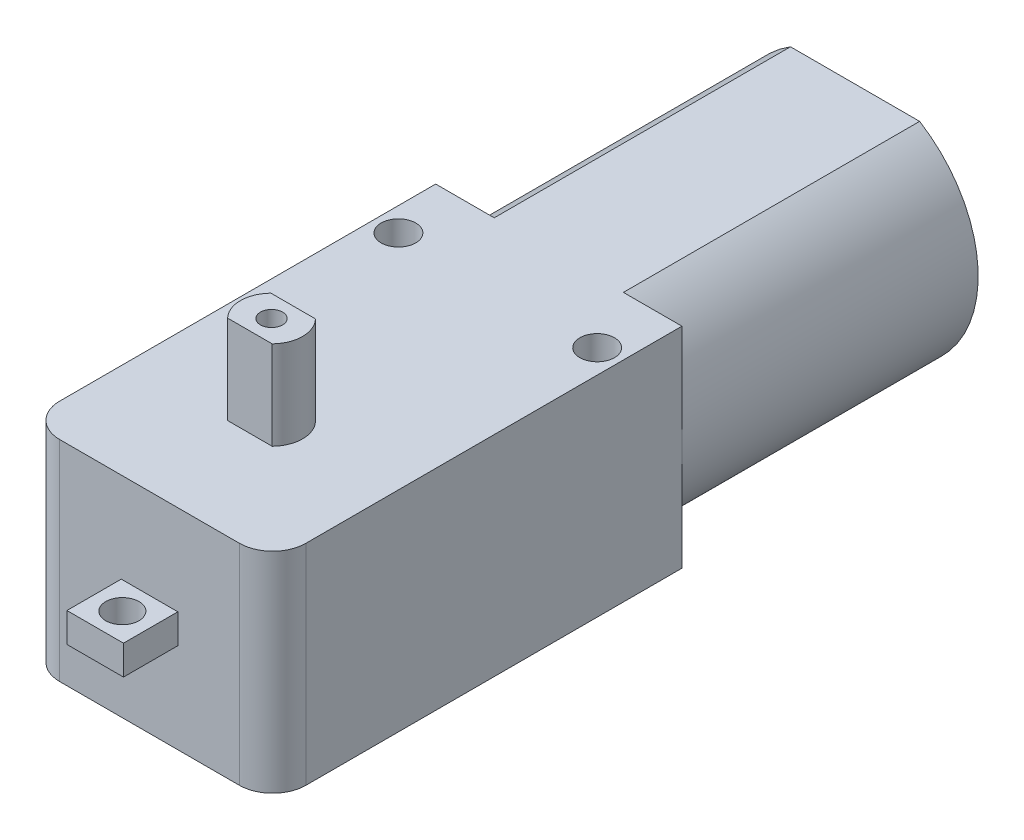
ISO-10303-21;
HEADER;
FILE_DESCRIPTION(('STEP AP214'),'2;1');
FILE_NAME('part.step','',(''),(''),'','','');
FILE_SCHEMA(('AUTOMOTIVE_DESIGN { 1 0 10303 214 1 1 1 1 }'));
ENDSEC;
DATA;
#1=APPLICATION_CONTEXT('core data for automotive mechanical design processes');
#2=APPLICATION_PROTOCOL_DEFINITION('international standard','automotive_design',2000,#1);
#3=PRODUCT_CONTEXT('',#1,'mechanical');
#4=PRODUCT('Part','Part','',(#3));
#5=PRODUCT_RELATED_PRODUCT_CATEGORY('part','',(#4));
#6=PRODUCT_DEFINITION_FORMATION('','',#4);
#7=PRODUCT_DEFINITION_CONTEXT('part definition',#1,'design');
#8=PRODUCT_DEFINITION('design','',#6,#7);
#9=PRODUCT_DEFINITION_SHAPE('','',#8);
#10=(LENGTH_UNIT() NAMED_UNIT(*) SI_UNIT(.MILLI.,.METRE.));
#11=(NAMED_UNIT(*) PLANE_ANGLE_UNIT() SI_UNIT($,.RADIAN.));
#12=(NAMED_UNIT(*) SI_UNIT($,.STERADIAN.) SOLID_ANGLE_UNIT());
#13=UNCERTAINTY_MEASURE_WITH_UNIT(LENGTH_MEASURE(1.E-05),#10,'distance_accuracy_value','');
#14=(GEOMETRIC_REPRESENTATION_CONTEXT(3) GLOBAL_UNCERTAINTY_ASSIGNED_CONTEXT((#13)) GLOBAL_UNIT_ASSIGNED_CONTEXT((#10,
#11,#12)) REPRESENTATION_CONTEXT('',''));
#15=CARTESIAN_POINT('',(0.,0.,0.));
#16=DIRECTION('',(0.,0.,1.));
#17=DIRECTION('',(1.,0.,0.));
#18=AXIS2_PLACEMENT_3D('',#15,#16,#17);
#19=CARTESIAN_POINT('',(0.,0.,-36.9));
#20=DIRECTION('',(0.,-1.,0.));
#21=DIRECTION('',(0.,0.,-1.));
#22=AXIS2_PLACEMENT_3D('',#19,#20,#21);
#23=PLANE('',#22);
#24=CARTESIAN_POINT('',(2.14,0.,-31.4));
#25=DIRECTION('',(0.,-1.,0.));
#26=DIRECTION('',(0.,0.,-1.));
#27=AXIS2_PLACEMENT_3D('',#24,#25,#26);
#28=CIRCLE('',#27,1.56);
#29=CARTESIAN_POINT('',(2.14,0.,-29.84));
#30=VERTEX_POINT('',#29);
#31=EDGE_CURVE('E771',#30,#30,#28,.T.);
#32=ORIENTED_EDGE('',*,*,#31,.F.);
#33=EDGE_LOOP('',(#32));
#34=FACE_BOUND('',#33,.T.);
#35=CARTESIAN_POINT('',(20.06,0.,-31.4));
#36=DIRECTION('',(0.,-1.,0.));
#37=DIRECTION('',(0.,0.,-1.));
#38=AXIS2_PLACEMENT_3D('',#35,#36,#37);
#39=CIRCLE('',#38,1.56);
#40=CARTESIAN_POINT('',(20.06,0.,-29.84));
#41=VERTEX_POINT('',#40);
#42=EDGE_CURVE('E774',#41,#41,#39,.T.);
#43=ORIENTED_EDGE('',*,*,#42,.F.);
#44=EDGE_LOOP('',(#43));
#45=FACE_BOUND('',#44,.T.);
#46=DIRECTION('',(1.,0.,0.));
#47=VECTOR('',#46,1.);
#48=CARTESIAN_POINT('',(0.,0.,0.));
#49=LINE('',#48,#47);
#50=CARTESIAN_POINT('',(3.,0.,0.));
#51=VERTEX_POINT('',#50);
#52=CARTESIAN_POINT('',(19.2,0.,0.));
#53=VERTEX_POINT('',#52);
#54=EDGE_CURVE('E320',#51,#53,#49,.T.);
#55=ORIENTED_EDGE('',*,*,#54,.F.);
#56=CARTESIAN_POINT('',(3.,0.,-3.));
#57=DIRECTION('',(0.,-1.,0.));
#58=DIRECTION('',(0.,0.,-1.));
#59=AXIS2_PLACEMENT_3D('',#56,#57,#58);
#60=CIRCLE('',#59,3.);
#61=CARTESIAN_POINT('',(0.,0.,-3.));
#62=VERTEX_POINT('',#61);
#63=EDGE_CURVE('E363',#51,#62,#60,.T.);
#64=ORIENTED_EDGE('',*,*,#63,.T.);
#65=DIRECTION('',(0.,0.,1.));
#66=VECTOR('',#65,1.);
#67=CARTESIAN_POINT('',(0.,0.,-36.9));
#68=LINE('',#67,#66);
#69=CARTESIAN_POINT('',(0.,0.,-36.9));
#70=VERTEX_POINT('',#69);
#71=EDGE_CURVE('E337',#70,#62,#68,.T.);
#72=ORIENTED_EDGE('',*,*,#71,.F.);
#73=DIRECTION('',(1.,0.,0.));
#74=VECTOR('',#73,1.);
#75=CARTESIAN_POINT('',(0.,0.,-36.9));
#76=LINE('',#75,#74);
#77=CARTESIAN_POINT('',(5.2769853168655,0.,-36.9));
#78=VERTEX_POINT('',#77);
#79=EDGE_CURVE('E326',#70,#78,#76,.T.);
#80=ORIENTED_EDGE('',*,*,#79,.T.);
#81=DIRECTION('',(0.,0.,1.));
#82=VECTOR('',#81,1.);
#83=CARTESIAN_POINT('',(5.2769853168655,0.,-63.61));
#84=LINE('',#83,#82);
#85=CARTESIAN_POINT('',(5.2769853168655,0.,-63.61));
#86=VERTEX_POINT('',#85);
#87=EDGE_CURVE('E281',#86,#78,#84,.T.);
#88=ORIENTED_EDGE('',*,*,#87,.F.);
#89=DIRECTION('',(-1.,0.,0.));
#90=VECTOR('',#89,1.);
#91=CARTESIAN_POINT('',(16.9230146831345,0.,-63.61));
#92=LINE('',#91,#90);
#93=CARTESIAN_POINT('',(16.9230146831345,0.,-63.61));
#94=VERTEX_POINT('',#93);
#95=EDGE_CURVE('E262',#94,#86,#92,.T.);
#96=ORIENTED_EDGE('',*,*,#95,.F.);
#97=DIRECTION('',(0.,0.,1.));
#98=VECTOR('',#97,1.);
#99=CARTESIAN_POINT('',(16.9230146831345,0.,-63.61));
#100=LINE('',#99,#98);
#101=CARTESIAN_POINT('',(16.9230146831345,0.,-36.9));
#102=VERTEX_POINT('',#101);
#103=EDGE_CURVE('E284',#94,#102,#100,.T.);
#104=ORIENTED_EDGE('',*,*,#103,.T.);
#105=CARTESIAN_POINT('',(22.2,0.,-36.9));
#106=VERTEX_POINT('',#105);
#107=EDGE_CURVE('E324',#102,#106,#76,.T.);
#108=ORIENTED_EDGE('',*,*,#107,.T.);
#109=DIRECTION('',(0.,0.,1.));
#110=VECTOR('',#109,1.);
#111=CARTESIAN_POINT('',(22.2,0.,-36.9));
#112=LINE('',#111,#110);
#113=CARTESIAN_POINT('',(22.2,0.,-3.));
#114=VERTEX_POINT('',#113);
#115=EDGE_CURVE('E347',#106,#114,#112,.T.);
#116=ORIENTED_EDGE('',*,*,#115,.T.);
#117=CARTESIAN_POINT('',(19.2,0.,-3.));
#118=DIRECTION('',(0.,-1.,0.));
#119=DIRECTION('',(0.,0.,-1.));
#120=AXIS2_PLACEMENT_3D('',#117,#118,#119);
#121=CIRCLE('',#120,3.);
#122=EDGE_CURVE('E361',#114,#53,#121,.T.);
#123=ORIENTED_EDGE('',*,*,#122,.T.);
#124=EDGE_LOOP('',(#55,#64,#72,#80,#88,#96,#104,#108,#116,#123));
#125=FACE_BOUND('',#124,.T.);
#126=DIRECTION('',(1.,0.,0.));
#127=VECTOR('',#126,1.);
#128=CARTESIAN_POINT('',(9.09064687025899,0.,-12.95));
#129=LINE('',#128,#127);
#130=CARTESIAN_POINT('',(9.09064687025899,0.,-12.95));
#131=VERTEX_POINT('',#130);
#132=CARTESIAN_POINT('',(13.109353129741,0.,-12.95));
#133=VERTEX_POINT('',#132);
#134=EDGE_CURVE('E761',#131,#133,#129,.T.);
#135=ORIENTED_EDGE('',*,*,#134,.F.);
#136=CARTESIAN_POINT('',(11.1,0.,-11.));
#137=DIRECTION('',(0.,-1.,0.));
#138=DIRECTION('',(0.,0.,-1.));
#139=AXIS2_PLACEMENT_3D('',#136,#137,#138);
#140=CIRCLE('',#139,2.8);
#141=CARTESIAN_POINT('',(9.09064687025899,0.,-9.05));
#142=VERTEX_POINT('',#141);
#143=EDGE_CURVE('E217',#142,#131,#140,.T.);
#144=ORIENTED_EDGE('',*,*,#143,.F.);
#145=DIRECTION('',(1.,0.,0.));
#146=VECTOR('',#145,1.);
#147=CARTESIAN_POINT('',(9.09064687025899,0.,-9.05));
#148=LINE('',#147,#146);
#149=CARTESIAN_POINT('',(13.109353129741,0.,-9.05));
#150=VERTEX_POINT('',#149);
#151=EDGE_CURVE('E214',#142,#150,#148,.T.);
#152=ORIENTED_EDGE('',*,*,#151,.T.);
#153=CARTESIAN_POINT('',(11.1,0.,-11.));
#154=DIRECTION('',(0.,-1.,0.));
#155=DIRECTION('',(0.,0.,-1.));
#156=AXIS2_PLACEMENT_3D('',#153,#154,#155);
#157=CIRCLE('',#156,2.8);
#158=EDGE_CURVE('E763',#133,#150,#157,.T.);
#159=ORIENTED_EDGE('',*,*,#158,.F.);
#160=EDGE_LOOP('',(#135,#144,#152,#159));
#161=FACE_BOUND('',#160,.T.);
#162=ADVANCED_FACE('F36',(#34,#45,#125,#161),#23,.T.);
#163=CARTESIAN_POINT('',(0.,18.9,-36.9));
#164=DIRECTION('',(0.,1.,0.));
#165=DIRECTION('',(0.,0.,1.));
#166=AXIS2_PLACEMENT_3D('',#163,#164,#165);
#167=PLANE('',#166);
#168=CARTESIAN_POINT('',(2.14,18.9,-31.4));
#169=DIRECTION('',(0.,1.,0.));
#170=DIRECTION('',(0.,0.,1.));
#171=AXIS2_PLACEMENT_3D('',#168,#169,#170);
#172=CIRCLE('',#171,1.56);
#173=CARTESIAN_POINT('',(2.14,18.9,-29.84));
#174=VERTEX_POINT('',#173);
#175=EDGE_CURVE('E777',#174,#174,#172,.T.);
#176=ORIENTED_EDGE('',*,*,#175,.F.);
#177=EDGE_LOOP('',(#176));
#178=FACE_BOUND('',#177,.T.);
#179=CARTESIAN_POINT('',(20.06,18.9,-31.4));
#180=DIRECTION('',(0.,1.,0.));
#181=DIRECTION('',(0.,0.,1.));
#182=AXIS2_PLACEMENT_3D('',#179,#180,#181);
#183=CIRCLE('',#182,1.56);
#184=CARTESIAN_POINT('',(20.06,18.9,-29.84));
#185=VERTEX_POINT('',#184);
#186=EDGE_CURVE('E778',#185,#185,#183,.T.);
#187=ORIENTED_EDGE('',*,*,#186,.F.);
#188=EDGE_LOOP('',(#187));
#189=FACE_BOUND('',#188,.T.);
#190=DIRECTION('',(0.,0.,1.));
#191=VECTOR('',#190,1.);
#192=CARTESIAN_POINT('',(0.,18.9,-36.9));
#193=LINE('',#192,#191);
#194=CARTESIAN_POINT('',(0.,18.9,-36.9));
#195=VERTEX_POINT('',#194);
#196=CARTESIAN_POINT('',(0.,18.9,-3.));
#197=VERTEX_POINT('',#196);
#198=EDGE_CURVE('E343',#195,#197,#193,.T.);
#199=ORIENTED_EDGE('',*,*,#198,.T.);
#200=CARTESIAN_POINT('',(3.,18.9,-3.));
#201=DIRECTION('',(0.,1.,0.));
#202=DIRECTION('',(0.,0.,1.));
#203=AXIS2_PLACEMENT_3D('',#200,#201,#202);
#204=CIRCLE('',#203,3.);
#205=CARTESIAN_POINT('',(3.,18.9,0.));
#206=VERTEX_POINT('',#205);
#207=EDGE_CURVE('E44',#197,#206,#204,.T.);
#208=ORIENTED_EDGE('',*,*,#207,.T.);
#209=DIRECTION('',(-1.,0.,0.));
#210=VECTOR('',#209,1.);
#211=CARTESIAN_POINT('',(0.,18.9,0.));
#212=LINE('',#211,#210);
#213=CARTESIAN_POINT('',(19.2,18.9,0.));
#214=VERTEX_POINT('',#213);
#215=EDGE_CURVE('E340',#214,#206,#212,.T.);
#216=ORIENTED_EDGE('',*,*,#215,.F.);
#217=CARTESIAN_POINT('',(19.2,18.9,-3.));
#218=DIRECTION('',(0.,1.,0.));
#219=DIRECTION('',(0.,0.,1.));
#220=AXIS2_PLACEMENT_3D('',#217,#218,#219);
#221=CIRCLE('',#220,3.);
#222=CARTESIAN_POINT('',(22.2,18.9,-3.));
#223=VERTEX_POINT('',#222);
#224=EDGE_CURVE('E51',#214,#223,#221,.T.);
#225=ORIENTED_EDGE('',*,*,#224,.T.);
#226=DIRECTION('',(0.,0.,1.));
#227=VECTOR('',#226,1.);
#228=CARTESIAN_POINT('',(22.2,18.9,-36.9));
#229=LINE('',#228,#227);
#230=CARTESIAN_POINT('',(22.2,18.9,-36.9));
#231=VERTEX_POINT('',#230);
#232=EDGE_CURVE('E345',#231,#223,#229,.T.);
#233=ORIENTED_EDGE('',*,*,#232,.F.);
#234=DIRECTION('',(-1.,0.,0.));
#235=VECTOR('',#234,1.);
#236=CARTESIAN_POINT('',(0.,18.9,-36.9));
#237=LINE('',#236,#235);
#238=CARTESIAN_POINT('',(16.9230146831345,18.9,-36.9));
#239=VERTEX_POINT('',#238);
#240=EDGE_CURVE('E334',#231,#239,#237,.T.);
#241=ORIENTED_EDGE('',*,*,#240,.T.);
#242=DIRECTION('',(0.,0.,1.));
#243=VECTOR('',#242,1.);
#244=CARTESIAN_POINT('',(16.9230146831345,18.9,-63.61));
#245=LINE('',#244,#243);
#246=CARTESIAN_POINT('',(16.9230146831345,18.9,-63.61));
#247=VERTEX_POINT('',#246);
#248=EDGE_CURVE('E269',#247,#239,#245,.T.);
#249=ORIENTED_EDGE('',*,*,#248,.F.);
#250=DIRECTION('',(1.,0.,0.));
#251=VECTOR('',#250,1.);
#252=CARTESIAN_POINT('',(16.9230146831345,18.9,-63.61));
#253=LINE('',#252,#251);
#254=CARTESIAN_POINT('',(5.2769853168655,18.9,-63.61));
#255=VERTEX_POINT('',#254);
#256=EDGE_CURVE('E267',#255,#247,#253,.T.);
#257=ORIENTED_EDGE('',*,*,#256,.F.);
#258=DIRECTION('',(0.,0.,1.));
#259=VECTOR('',#258,1.);
#260=CARTESIAN_POINT('',(5.2769853168655,18.9,-63.61));
#261=LINE('',#260,#259);
#262=CARTESIAN_POINT('',(5.2769853168655,18.9,-36.9));
#263=VERTEX_POINT('',#262);
#264=EDGE_CURVE('E278',#255,#263,#261,.T.);
#265=ORIENTED_EDGE('',*,*,#264,.T.);
#266=EDGE_CURVE('E333',#263,#195,#237,.T.);
#267=ORIENTED_EDGE('',*,*,#266,.T.);
#268=EDGE_LOOP('',(#199,#208,#216,#225,#233,#241,#249,#257,#265,#267));
#269=FACE_BOUND('',#268,.T.);
#270=DIRECTION('',(1.,0.,0.));
#271=VECTOR('',#270,1.);
#272=CARTESIAN_POINT('',(9.09064687025899,18.9,-9.05));
#273=LINE('',#272,#271);
#274=CARTESIAN_POINT('',(9.09064687025899,18.9,-9.05));
#275=VERTEX_POINT('',#274);
#276=CARTESIAN_POINT('',(13.109353129741,18.9,-9.05));
#277=VERTEX_POINT('',#276);
#278=EDGE_CURVE('E221',#275,#277,#273,.T.);
#279=ORIENTED_EDGE('',*,*,#278,.F.);
#280=CARTESIAN_POINT('',(11.1,18.9,-11.));
#281=DIRECTION('',(0.,1.,0.));
#282=DIRECTION('',(0.,0.,1.));
#283=AXIS2_PLACEMENT_3D('',#280,#281,#282);
#284=CIRCLE('',#283,2.8);
#285=CARTESIAN_POINT('',(9.09064687025899,18.9,-12.95));
#286=VERTEX_POINT('',#285);
#287=EDGE_CURVE('E218',#286,#275,#284,.T.);
#288=ORIENTED_EDGE('',*,*,#287,.F.);
#289=DIRECTION('',(-1.,0.,0.));
#290=VECTOR('',#289,1.);
#291=CARTESIAN_POINT('',(9.09064687025899,18.9,-12.95));
#292=LINE('',#291,#290);
#293=CARTESIAN_POINT('',(13.109353129741,18.9,-12.95));
#294=VERTEX_POINT('',#293);
#295=EDGE_CURVE('E231',#294,#286,#292,.T.);
#296=ORIENTED_EDGE('',*,*,#295,.F.);
#297=CARTESIAN_POINT('',(11.1,18.9,-11.));
#298=DIRECTION('',(0.,1.,0.));
#299=DIRECTION('',(0.,0.,1.));
#300=AXIS2_PLACEMENT_3D('',#297,#298,#299);
#301=CIRCLE('',#300,2.8);
#302=EDGE_CURVE('E239',#277,#294,#301,.T.);
#303=ORIENTED_EDGE('',*,*,#302,.F.);
#304=EDGE_LOOP('',(#279,#288,#296,#303));
#305=FACE_BOUND('',#304,.T.);
#306=ADVANCED_FACE('F367',(#178,#189,#269,#305),#167,.T.);
#307=CARTESIAN_POINT('',(0.,0.,-36.9));
#308=DIRECTION('',(0.,0.,-1.));
#309=DIRECTION('',(-1.,0.,0.));
#310=AXIS2_PLACEMENT_3D('',#307,#308,#309);
#311=PLANE('',#310);
#312=CARTESIAN_POINT('',(11.1,9.45,-36.9));
#313=DIRECTION('',(0.,0.,-1.));
#314=DIRECTION('',(-1.,0.,0.));
#315=AXIS2_PLACEMENT_3D('',#312,#313,#314);
#316=CIRCLE('',#315,11.1);
#317=CARTESIAN_POINT('',(22.2,9.45,-36.9));
#318=VERTEX_POINT('',#317);
#319=EDGE_CURVE('E256',#239,#318,#316,.T.);
#320=ORIENTED_EDGE('',*,*,#319,.F.);
#321=ORIENTED_EDGE('',*,*,#240,.F.);
#322=DIRECTION('',(0.,1.,0.));
#323=VECTOR('',#322,1.);
#324=CARTESIAN_POINT('',(22.2,0.,-36.9));
#325=LINE('',#324,#323);
#326=EDGE_CURVE('E329',#318,#231,#325,.T.);
#327=ORIENTED_EDGE('',*,*,#326,.F.);
#328=EDGE_LOOP('',(#320,#321,#327));
#329=FACE_BOUND('',#328,.T.);
#330=ADVANCED_FACE('F408',(#329),#311,.T.);
#331=EDGE_CURVE('E272',#318,#102,#316,.T.);
#332=ORIENTED_EDGE('',*,*,#331,.F.);
#333=EDGE_CURVE('E330',#106,#318,#325,.T.);
#334=ORIENTED_EDGE('',*,*,#333,.F.);
#335=ORIENTED_EDGE('',*,*,#107,.F.);
#336=EDGE_LOOP('',(#332,#334,#335));
#337=FACE_BOUND('',#336,.T.);
#338=ADVANCED_FACE('F411',(#337),#311,.T.);
#339=CARTESIAN_POINT('',(11.1,9.45,-36.9));
#340=DIRECTION('',(0.,0.,-1.));
#341=DIRECTION('',(-1.,0.,0.));
#342=AXIS2_PLACEMENT_3D('',#339,#340,#341);
#343=CIRCLE('',#342,11.1);
#344=CARTESIAN_POINT('',(0.,9.45,-36.9));
#345=VERTEX_POINT('',#344);
#346=EDGE_CURVE('E263',#78,#345,#343,.T.);
#347=ORIENTED_EDGE('',*,*,#346,.F.);
#348=ORIENTED_EDGE('',*,*,#79,.F.);
#349=DIRECTION('',(0.,-1.,0.));
#350=VECTOR('',#349,1.);
#351=CARTESIAN_POINT('',(0.,0.,-36.9));
#352=LINE('',#351,#350);
#353=EDGE_CURVE('E325',#345,#70,#352,.T.);
#354=ORIENTED_EDGE('',*,*,#353,.F.);
#355=EDGE_LOOP('',(#347,#348,#354));
#356=FACE_BOUND('',#355,.T.);
#357=ADVANCED_FACE('F385',(#356),#311,.T.);
#358=CARTESIAN_POINT('',(0.,0.,0.));
#359=DIRECTION('',(0.,0.,-1.));
#360=DIRECTION('',(-1.,0.,0.));
#361=AXIS2_PLACEMENT_3D('',#358,#359,#360);
#362=PLANE('',#361);
#363=ORIENTED_EDGE('',*,*,#215,.T.);
#364=DIRECTION('',(0.,-1.,0.));
#365=VECTOR('',#364,1.);
#366=CARTESIAN_POINT('',(3.,0.,0.));
#367=LINE('',#366,#365);
#368=EDGE_CURVE('E358',#206,#51,#367,.T.);
#369=ORIENTED_EDGE('',*,*,#368,.T.);
#370=ORIENTED_EDGE('',*,*,#54,.T.);
#371=DIRECTION('',(0.,1.,0.));
#372=VECTOR('',#371,1.);
#373=CARTESIAN_POINT('',(19.2,18.9,0.));
#374=LINE('',#373,#372);
#375=EDGE_CURVE('E355',#53,#214,#374,.T.);
#376=ORIENTED_EDGE('',*,*,#375,.T.);
#377=EDGE_LOOP('',(#363,#369,#370,#376));
#378=FACE_BOUND('',#377,.T.);
#379=DIRECTION('',(0.,1.,0.));
#380=VECTOR('',#379,1.);
#381=CARTESIAN_POINT('',(13.65,10.775,0.));
#382=LINE('',#381,#380);
#383=CARTESIAN_POINT('',(13.65,8.125,0.));
#384=VERTEX_POINT('',#383);
#385=CARTESIAN_POINT('',(13.65,10.775,0.));
#386=VERTEX_POINT('',#385);
#387=EDGE_CURVE('E287',#384,#386,#382,.T.);
#388=ORIENTED_EDGE('',*,*,#387,.F.);
#389=DIRECTION('',(1.,0.,0.));
#390=VECTOR('',#389,1.);
#391=CARTESIAN_POINT('',(8.55,8.125,0.));
#392=LINE('',#391,#390);
#393=CARTESIAN_POINT('',(8.55,8.125,0.));
#394=VERTEX_POINT('',#393);
#395=EDGE_CURVE('E292',#394,#384,#392,.T.);
#396=ORIENTED_EDGE('',*,*,#395,.F.);
#397=DIRECTION('',(0.,-1.,0.));
#398=VECTOR('',#397,1.);
#399=CARTESIAN_POINT('',(8.55,10.775,0.));
#400=LINE('',#399,#398);
#401=CARTESIAN_POINT('',(8.55,10.775,0.));
#402=VERTEX_POINT('',#401);
#403=EDGE_CURVE('E304',#402,#394,#400,.T.);
#404=ORIENTED_EDGE('',*,*,#403,.F.);
#405=DIRECTION('',(-1.,0.,0.));
#406=VECTOR('',#405,1.);
#407=CARTESIAN_POINT('',(8.55,10.775,0.));
#408=LINE('',#407,#406);
#409=EDGE_CURVE('E301',#386,#402,#408,.T.);
#410=ORIENTED_EDGE('',*,*,#409,.F.);
#411=EDGE_LOOP('',(#388,#396,#404,#410));
#412=FACE_BOUND('',#411,.T.);
#413=ADVANCED_FACE('F372',(#378,#412),#362,.F.);
#414=CARTESIAN_POINT('',(0.,0.,-36.9));
#415=DIRECTION('',(-1.,0.,0.));
#416=DIRECTION('',(0.,0.,1.));
#417=AXIS2_PLACEMENT_3D('',#414,#415,#416);
#418=PLANE('',#417);
#419=ORIENTED_EDGE('',*,*,#71,.T.);
#420=DIRECTION('',(0.,-1.,0.));
#421=VECTOR('',#420,1.);
#422=CARTESIAN_POINT('',(0.,18.9,-3.));
#423=LINE('',#422,#421);
#424=EDGE_CURVE('E59',#62,#197,#423,.F.);
#425=ORIENTED_EDGE('',*,*,#424,.T.);
#426=ORIENTED_EDGE('',*,*,#198,.F.);
#427=EDGE_CURVE('E321',#195,#345,#352,.T.);
#428=ORIENTED_EDGE('',*,*,#427,.T.);
#429=ORIENTED_EDGE('',*,*,#353,.T.);
#430=EDGE_LOOP('',(#419,#425,#426,#428,#429));
#431=FACE_BOUND('',#430,.T.);
#432=ADVANCED_FACE('F381',(#431),#418,.T.);
#433=CARTESIAN_POINT('',(22.2,0.,-36.9));
#434=DIRECTION('',(1.,0.,0.));
#435=DIRECTION('',(0.,0.,-1.));
#436=AXIS2_PLACEMENT_3D('',#433,#434,#435);
#437=PLANE('',#436);
#438=ORIENTED_EDGE('',*,*,#232,.T.);
#439=DIRECTION('',(0.,1.,0.));
#440=VECTOR('',#439,1.);
#441=CARTESIAN_POINT('',(22.2,0.,-3.));
#442=LINE('',#441,#440);
#443=EDGE_CURVE('E11',#223,#114,#442,.F.);
#444=ORIENTED_EDGE('',*,*,#443,.T.);
#445=ORIENTED_EDGE('',*,*,#115,.F.);
#446=ORIENTED_EDGE('',*,*,#333,.T.);
#447=ORIENTED_EDGE('',*,*,#326,.T.);
#448=EDGE_LOOP('',(#438,#444,#445,#446,#447));
#449=FACE_BOUND('',#448,.T.);
#450=ADVANCED_FACE('F410',(#449),#437,.T.);
#451=EDGE_CURVE('E275',#345,#263,#343,.T.);
#452=ORIENTED_EDGE('',*,*,#451,.F.);
#453=ORIENTED_EDGE('',*,*,#427,.F.);
#454=ORIENTED_EDGE('',*,*,#266,.F.);
#455=EDGE_LOOP('',(#452,#453,#454));
#456=FACE_BOUND('',#455,.T.);
#457=ADVANCED_FACE('F418',(#456),#311,.T.);
#458=CARTESIAN_POINT('',(13.65,10.775,4.9));
#459=DIRECTION('',(-1.,0.,0.));
#460=DIRECTION('',(0.,0.,1.));
#461=AXIS2_PLACEMENT_3D('',#458,#459,#460);
#462=PLANE('',#461);
#463=ORIENTED_EDGE('',*,*,#387,.T.);
#464=DIRECTION('',(0.,0.,-1.));
#465=VECTOR('',#464,1.);
#466=CARTESIAN_POINT('',(13.65,10.775,4.9));
#467=LINE('',#466,#465);
#468=CARTESIAN_POINT('',(13.65,10.775,4.9));
#469=VERTEX_POINT('',#468);
#470=EDGE_CURVE('E317',#469,#386,#467,.T.);
#471=ORIENTED_EDGE('',*,*,#470,.F.);
#472=DIRECTION('',(0.,1.,0.));
#473=VECTOR('',#472,1.);
#474=CARTESIAN_POINT('',(13.65,10.775,4.9));
#475=LINE('',#474,#473);
#476=CARTESIAN_POINT('',(13.65,8.125,4.9));
#477=VERTEX_POINT('',#476);
#478=EDGE_CURVE('E288',#477,#469,#475,.T.);
#479=ORIENTED_EDGE('',*,*,#478,.F.);
#480=DIRECTION('',(0.,0.,-1.));
#481=VECTOR('',#480,1.);
#482=CARTESIAN_POINT('',(13.65,8.125,4.9));
#483=LINE('',#482,#481);
#484=EDGE_CURVE('E298',#477,#384,#483,.T.);
#485=ORIENTED_EDGE('',*,*,#484,.T.);
#486=EDGE_LOOP('',(#463,#471,#479,#485));
#487=FACE_BOUND('',#486,.T.);
#488=ADVANCED_FACE('F524',(#487),#462,.F.);
#489=CARTESIAN_POINT('',(8.55,10.775,4.9));
#490=DIRECTION('',(0.,-1.,0.));
#491=DIRECTION('',(0.,0.,-1.));
#492=AXIS2_PLACEMENT_3D('',#489,#490,#491);
#493=PLANE('',#492);
#494=CARTESIAN_POINT('',(11.1,10.775,2.45));
#495=DIRECTION('',(0.,1.,0.));
#496=DIRECTION('',(0.,0.,1.));
#497=AXIS2_PLACEMENT_3D('',#494,#495,#496);
#498=CIRCLE('',#497,1.5);
#499=CARTESIAN_POINT('',(11.1,10.775,3.95));
#500=VERTEX_POINT('',#499);
#501=EDGE_CURVE('E354',#500,#500,#498,.T.);
#502=ORIENTED_EDGE('',*,*,#501,.F.);
#503=EDGE_LOOP('',(#502));
#504=FACE_BOUND('',#503,.T.);
#505=ORIENTED_EDGE('',*,*,#409,.T.);
#506=DIRECTION('',(0.,0.,-1.));
#507=VECTOR('',#506,1.);
#508=CARTESIAN_POINT('',(8.55,10.775,4.9));
#509=LINE('',#508,#507);
#510=CARTESIAN_POINT('',(8.55,10.775,4.9));
#511=VERTEX_POINT('',#510);
#512=EDGE_CURVE('E314',#511,#402,#509,.T.);
#513=ORIENTED_EDGE('',*,*,#512,.F.);
#514=DIRECTION('',(-1.,0.,0.));
#515=VECTOR('',#514,1.);
#516=CARTESIAN_POINT('',(8.55,10.775,4.9));
#517=LINE('',#516,#515);
#518=EDGE_CURVE('E291',#469,#511,#517,.T.);
#519=ORIENTED_EDGE('',*,*,#518,.F.);
#520=ORIENTED_EDGE('',*,*,#470,.T.);
#521=EDGE_LOOP('',(#505,#513,#519,#520));
#522=FACE_BOUND('',#521,.T.);
#523=ADVANCED_FACE('F521',(#504,#522),#493,.F.);
#524=CARTESIAN_POINT('',(8.55,10.775,4.9));
#525=DIRECTION('',(1.,0.,0.));
#526=DIRECTION('',(0.,0.,-1.));
#527=AXIS2_PLACEMENT_3D('',#524,#525,#526);
#528=PLANE('',#527);
#529=ORIENTED_EDGE('',*,*,#403,.T.);
#530=DIRECTION('',(0.,0.,-1.));
#531=VECTOR('',#530,1.);
#532=CARTESIAN_POINT('',(8.55,8.125,4.9));
#533=LINE('',#532,#531);
#534=CARTESIAN_POINT('',(8.55,8.125,4.9));
#535=VERTEX_POINT('',#534);
#536=EDGE_CURVE('E311',#535,#394,#533,.T.);
#537=ORIENTED_EDGE('',*,*,#536,.F.);
#538=DIRECTION('',(0.,-1.,0.));
#539=VECTOR('',#538,1.);
#540=CARTESIAN_POINT('',(8.55,10.775,4.9));
#541=LINE('',#540,#539);
#542=EDGE_CURVE('E294',#511,#535,#541,.T.);
#543=ORIENTED_EDGE('',*,*,#542,.F.);
#544=ORIENTED_EDGE('',*,*,#512,.T.);
#545=EDGE_LOOP('',(#529,#537,#543,#544));
#546=FACE_BOUND('',#545,.T.);
#547=ADVANCED_FACE('F517',(#546),#528,.F.);
#548=CARTESIAN_POINT('',(8.55,8.125,4.9));
#549=DIRECTION('',(0.,1.,0.));
#550=DIRECTION('',(0.,0.,1.));
#551=AXIS2_PLACEMENT_3D('',#548,#549,#550);
#552=PLANE('',#551);
#553=CARTESIAN_POINT('',(11.1,8.125,2.45));
#554=DIRECTION('',(0.,1.,0.));
#555=DIRECTION('',(0.,0.,1.));
#556=AXIS2_PLACEMENT_3D('',#553,#554,#555);
#557=CIRCLE('',#556,1.5);
#558=CARTESIAN_POINT('',(11.1,8.125,3.95));
#559=VERTEX_POINT('',#558);
#560=EDGE_CURVE('E351',#559,#559,#557,.T.);
#561=ORIENTED_EDGE('',*,*,#560,.T.);
#562=EDGE_LOOP('',(#561));
#563=FACE_BOUND('',#562,.T.);
#564=ORIENTED_EDGE('',*,*,#395,.T.);
#565=ORIENTED_EDGE('',*,*,#484,.F.);
#566=DIRECTION('',(1.,0.,0.));
#567=VECTOR('',#566,1.);
#568=CARTESIAN_POINT('',(8.55,8.125,4.9));
#569=LINE('',#568,#567);
#570=EDGE_CURVE('E296',#535,#477,#569,.T.);
#571=ORIENTED_EDGE('',*,*,#570,.F.);
#572=ORIENTED_EDGE('',*,*,#536,.T.);
#573=EDGE_LOOP('',(#564,#565,#571,#572));
#574=FACE_BOUND('',#573,.T.);
#575=ADVANCED_FACE('F513',(#563,#574),#552,.F.);
#576=CARTESIAN_POINT('',(0.,0.,4.9));
#577=DIRECTION('',(0.,0.,1.));
#578=DIRECTION('',(1.,0.,0.));
#579=AXIS2_PLACEMENT_3D('',#576,#577,#578);
#580=PLANE('',#579);
#581=ORIENTED_EDGE('',*,*,#478,.T.);
#582=ORIENTED_EDGE('',*,*,#518,.T.);
#583=ORIENTED_EDGE('',*,*,#542,.T.);
#584=ORIENTED_EDGE('',*,*,#570,.T.);
#585=EDGE_LOOP('',(#581,#582,#583,#584));
#586=FACE_BOUND('',#585,.T.);
#587=ADVANCED_FACE('F510',(#586),#580,.T.);
#588=CARTESIAN_POINT('',(11.1,9.45,-63.61));
#589=DIRECTION('',(0.,0.,1.));
#590=DIRECTION('',(1.,0.,0.));
#591=AXIS2_PLACEMENT_3D('',#588,#589,#590);
#592=CYLINDRICAL_SURFACE('',#591,11.1);
#593=ORIENTED_EDGE('',*,*,#319,.T.);
#594=ORIENTED_EDGE('',*,*,#331,.T.);
#595=ORIENTED_EDGE('',*,*,#103,.F.);
#596=CARTESIAN_POINT('',(11.1,9.45,-63.61));
#597=DIRECTION('',(0.,0.,-1.));
#598=DIRECTION('',(-1.,0.,0.));
#599=AXIS2_PLACEMENT_3D('',#596,#597,#598);
#600=CIRCLE('',#599,11.1);
#601=EDGE_CURVE('E259',#247,#94,#600,.T.);
#602=ORIENTED_EDGE('',*,*,#601,.F.);
#603=ORIENTED_EDGE('',*,*,#248,.T.);
#604=EDGE_LOOP('',(#593,#594,#595,#602,#603));
#605=FACE_BOUND('',#604,.T.);
#606=ADVANCED_FACE('F401',(#605),#592,.T.);
#607=CARTESIAN_POINT('',(11.1,9.45,-63.61));
#608=DIRECTION('',(0.,0.,1.));
#609=DIRECTION('',(1.,0.,0.));
#610=AXIS2_PLACEMENT_3D('',#607,#608,#609);
#611=CYLINDRICAL_SURFACE('',#610,11.1);
#612=ORIENTED_EDGE('',*,*,#346,.T.);
#613=ORIENTED_EDGE('',*,*,#451,.T.);
#614=ORIENTED_EDGE('',*,*,#264,.F.);
#615=CARTESIAN_POINT('',(11.1,9.45,-63.61));
#616=DIRECTION('',(0.,0.,-1.));
#617=DIRECTION('',(-1.,0.,0.));
#618=AXIS2_PLACEMENT_3D('',#615,#616,#617);
#619=CIRCLE('',#618,11.1);
#620=EDGE_CURVE('E265',#86,#255,#619,.T.);
#621=ORIENTED_EDGE('',*,*,#620,.F.);
#622=ORIENTED_EDGE('',*,*,#87,.T.);
#623=EDGE_LOOP('',(#612,#613,#614,#621,#622));
#624=FACE_BOUND('',#623,.T.);
#625=ADVANCED_FACE('F389',(#624),#611,.T.);
#626=CARTESIAN_POINT('',(11.1,9.45,-63.61));
#627=DIRECTION('',(0.,0.,-1.));
#628=DIRECTION('',(-1.,0.,0.));
#629=AXIS2_PLACEMENT_3D('',#626,#627,#628);
#630=PLANE('',#629);
#631=CARTESIAN_POINT('',(11.1,9.45,-63.61));
#632=DIRECTION('',(0.,0.,-1.));
#633=DIRECTION('',(-1.,0.,0.));
#634=AXIS2_PLACEMENT_3D('',#631,#632,#633);
#635=CIRCLE('',#634,1.);
#636=CARTESIAN_POINT('',(10.1,9.45,-63.61));
#637=VERTEX_POINT('',#636);
#638=EDGE_CURVE('E252',#637,#637,#635,.T.);
#639=ORIENTED_EDGE('',*,*,#638,.F.);
#640=EDGE_LOOP('',(#639));
#641=FACE_BOUND('',#640,.T.);
#642=ORIENTED_EDGE('',*,*,#601,.T.);
#643=ORIENTED_EDGE('',*,*,#95,.T.);
#644=ORIENTED_EDGE('',*,*,#620,.T.);
#645=ORIENTED_EDGE('',*,*,#256,.T.);
#646=EDGE_LOOP('',(#642,#643,#644,#645));
#647=FACE_BOUND('',#646,.T.);
#648=ADVANCED_FACE('F394',(#641,#647),#630,.T.);
#649=CARTESIAN_POINT('',(11.1,9.45,-64.61));
#650=DIRECTION('',(0.,0.,1.));
#651=DIRECTION('',(1.,0.,0.));
#652=AXIS2_PLACEMENT_3D('',#649,#650,#651);
#653=CYLINDRICAL_SURFACE('',#652,1.);
#654=CARTESIAN_POINT('',(11.1,9.45,-64.61));
#655=DIRECTION('',(0.,0.,-1.));
#656=DIRECTION('',(-1.,0.,0.));
#657=AXIS2_PLACEMENT_3D('',#654,#655,#656);
#658=CIRCLE('',#657,1.);
#659=CARTESIAN_POINT('',(10.1,9.45,-64.61));
#660=VERTEX_POINT('',#659);
#661=EDGE_CURVE('E253',#660,#660,#658,.T.);
#662=ORIENTED_EDGE('',*,*,#661,.F.);
#663=EDGE_LOOP('',(#662));
#664=FACE_BOUND('',#663,.T.);
#665=ORIENTED_EDGE('',*,*,#638,.T.);
#666=EDGE_LOOP('',(#665));
#667=FACE_BOUND('',#666,.T.);
#668=ADVANCED_FACE('F498',(#664,#667),#653,.T.);
#669=CARTESIAN_POINT('',(11.1,9.45,-64.61));
#670=DIRECTION('',(0.,0.,-1.));
#671=DIRECTION('',(-1.,0.,0.));
#672=AXIS2_PLACEMENT_3D('',#669,#670,#671);
#673=PLANE('',#672);
#674=ORIENTED_EDGE('',*,*,#661,.T.);
#675=EDGE_LOOP('',(#674));
#676=FACE_BOUND('',#675,.T.);
#677=ADVANCED_FACE('F494',(#676),#673,.T.);
#678=CARTESIAN_POINT('',(11.1,26.9,-11.));
#679=DIRECTION('',(0.,-1.,0.));
#680=DIRECTION('',(0.,0.,-1.));
#681=AXIS2_PLACEMENT_3D('',#678,#679,#680);
#682=CYLINDRICAL_SURFACE('',#681,2.8);
#683=ORIENTED_EDGE('',*,*,#287,.T.);
#684=DIRECTION('',(0.,-1.,0.));
#685=VECTOR('',#684,1.);
#686=CARTESIAN_POINT('',(9.09064687025899,26.9,-9.05));
#687=LINE('',#686,#685);
#688=CARTESIAN_POINT('',(9.09064687025899,26.9,-9.05));
#689=VERTEX_POINT('',#688);
#690=EDGE_CURVE('E250',#689,#275,#687,.T.);
#691=ORIENTED_EDGE('',*,*,#690,.F.);
#692=CARTESIAN_POINT('',(11.1,26.9,-11.));
#693=DIRECTION('',(0.,1.,0.));
#694=DIRECTION('',(0.,0.,1.));
#695=AXIS2_PLACEMENT_3D('',#692,#693,#694);
#696=CIRCLE('',#695,2.8);
#697=CARTESIAN_POINT('',(9.09064687025899,26.9,-12.95));
#698=VERTEX_POINT('',#697);
#699=EDGE_CURVE('E227',#698,#689,#696,.T.);
#700=ORIENTED_EDGE('',*,*,#699,.F.);
#701=DIRECTION('',(0.,-1.,0.));
#702=VECTOR('',#701,1.);
#703=CARTESIAN_POINT('',(9.09064687025899,26.9,-12.95));
#704=LINE('',#703,#702);
#705=EDGE_CURVE('E236',#698,#286,#704,.T.);
#706=ORIENTED_EDGE('',*,*,#705,.T.);
#707=EDGE_LOOP('',(#683,#691,#700,#706));
#708=FACE_BOUND('',#707,.T.);
#709=ADVANCED_FACE('F490',(#708),#682,.T.);
#710=CARTESIAN_POINT('',(9.09064687025899,26.9,-9.05));
#711=DIRECTION('',(0.,0.,-1.));
#712=DIRECTION('',(-1.,0.,0.));
#713=AXIS2_PLACEMENT_3D('',#710,#711,#712);
#714=PLANE('',#713);
#715=ORIENTED_EDGE('',*,*,#278,.T.);
#716=DIRECTION('',(0.,-1.,0.));
#717=VECTOR('',#716,1.);
#718=CARTESIAN_POINT('',(13.109353129741,26.9,-9.05));
#719=LINE('',#718,#717);
#720=CARTESIAN_POINT('',(13.109353129741,26.9,-9.05));
#721=VERTEX_POINT('',#720);
#722=EDGE_CURVE('E247',#721,#277,#719,.T.);
#723=ORIENTED_EDGE('',*,*,#722,.F.);
#724=DIRECTION('',(1.,0.,0.));
#725=VECTOR('',#724,1.);
#726=CARTESIAN_POINT('',(9.09064687025899,26.9,-9.05));
#727=LINE('',#726,#725);
#728=EDGE_CURVE('E230',#689,#721,#727,.T.);
#729=ORIENTED_EDGE('',*,*,#728,.F.);
#730=ORIENTED_EDGE('',*,*,#690,.T.);
#731=EDGE_LOOP('',(#715,#723,#729,#730));
#732=FACE_BOUND('',#731,.T.);
#733=ADVANCED_FACE('F486',(#732),#714,.F.);
#734=CARTESIAN_POINT('',(11.1,26.9,-11.));
#735=DIRECTION('',(0.,-1.,0.));
#736=DIRECTION('',(0.,0.,-1.));
#737=AXIS2_PLACEMENT_3D('',#734,#735,#736);
#738=CYLINDRICAL_SURFACE('',#737,2.8);
#739=ORIENTED_EDGE('',*,*,#302,.T.);
#740=DIRECTION('',(0.,-1.,0.));
#741=VECTOR('',#740,1.);
#742=CARTESIAN_POINT('',(13.109353129741,26.9,-12.95));
#743=LINE('',#742,#741);
#744=CARTESIAN_POINT('',(13.109353129741,26.9,-12.95));
#745=VERTEX_POINT('',#744);
#746=EDGE_CURVE('E245',#745,#294,#743,.T.);
#747=ORIENTED_EDGE('',*,*,#746,.F.);
#748=CARTESIAN_POINT('',(11.1,26.9,-11.));
#749=DIRECTION('',(0.,1.,0.));
#750=DIRECTION('',(0.,0.,1.));
#751=AXIS2_PLACEMENT_3D('',#748,#749,#750);
#752=CIRCLE('',#751,2.8);
#753=EDGE_CURVE('E233',#721,#745,#752,.T.);
#754=ORIENTED_EDGE('',*,*,#753,.F.);
#755=ORIENTED_EDGE('',*,*,#722,.T.);
#756=EDGE_LOOP('',(#739,#747,#754,#755));
#757=FACE_BOUND('',#756,.T.);
#758=ADVANCED_FACE('F482',(#757),#738,.T.);
#759=CARTESIAN_POINT('',(9.09064687025899,26.9,-12.95));
#760=DIRECTION('',(0.,0.,1.));
#761=DIRECTION('',(1.,0.,0.));
#762=AXIS2_PLACEMENT_3D('',#759,#760,#761);
#763=PLANE('',#762);
#764=ORIENTED_EDGE('',*,*,#295,.T.);
#765=ORIENTED_EDGE('',*,*,#705,.F.);
#766=DIRECTION('',(-1.,0.,0.));
#767=VECTOR('',#766,1.);
#768=CARTESIAN_POINT('',(9.09064687025899,26.9,-12.95));
#769=LINE('',#768,#767);
#770=EDGE_CURVE('E235',#745,#698,#769,.T.);
#771=ORIENTED_EDGE('',*,*,#770,.F.);
#772=ORIENTED_EDGE('',*,*,#746,.T.);
#773=EDGE_LOOP('',(#764,#765,#771,#772));
#774=FACE_BOUND('',#773,.T.);
#775=ADVANCED_FACE('F478',(#774),#763,.F.);
#776=CARTESIAN_POINT('',(11.1,26.9,-11.));
#777=DIRECTION('',(0.,1.,0.));
#778=DIRECTION('',(0.,0.,1.));
#779=AXIS2_PLACEMENT_3D('',#776,#777,#778);
#780=PLANE('',#779);
#781=CARTESIAN_POINT('',(11.1,26.9,-11.));
#782=DIRECTION('',(0.,1.,0.));
#783=DIRECTION('',(0.,0.,1.));
#784=AXIS2_PLACEMENT_3D('',#781,#782,#783);
#785=CIRCLE('',#784,0.999999999999999);
#786=CARTESIAN_POINT('',(11.1,26.9,-10.));
#787=VERTEX_POINT('',#786);
#788=EDGE_CURVE('E753',#787,#787,#785,.T.);
#789=ORIENTED_EDGE('',*,*,#788,.F.);
#790=EDGE_LOOP('',(#789));
#791=FACE_BOUND('',#790,.T.);
#792=ORIENTED_EDGE('',*,*,#699,.T.);
#793=ORIENTED_EDGE('',*,*,#728,.T.);
#794=ORIENTED_EDGE('',*,*,#753,.T.);
#795=ORIENTED_EDGE('',*,*,#770,.T.);
#796=EDGE_LOOP('',(#792,#793,#794,#795));
#797=FACE_BOUND('',#796,.T.);
#798=ADVANCED_FACE('F475',(#791,#797),#780,.T.);
#799=CARTESIAN_POINT('',(11.1,-8.,-11.));
#800=DIRECTION('',(0.,1.,0.));
#801=DIRECTION('',(0.,0.,1.));
#802=AXIS2_PLACEMENT_3D('',#799,#800,#801);
#803=CYLINDRICAL_SURFACE('',#802,2.8);
#804=ORIENTED_EDGE('',*,*,#143,.T.);
#805=DIRECTION('',(0.,1.,0.));
#806=VECTOR('',#805,1.);
#807=CARTESIAN_POINT('',(9.09064687025899,-8.,-12.95));
#808=LINE('',#807,#806);
#809=CARTESIAN_POINT('',(9.09064687025899,-8.,-12.95));
#810=VERTEX_POINT('',#809);
#811=EDGE_CURVE('E198',#810,#131,#808,.T.);
#812=ORIENTED_EDGE('',*,*,#811,.F.);
#813=CARTESIAN_POINT('',(11.1,-8.,-11.));
#814=DIRECTION('',(0.,-1.,0.));
#815=DIRECTION('',(0.,0.,-1.));
#816=AXIS2_PLACEMENT_3D('',#813,#814,#815);
#817=CIRCLE('',#816,2.8);
#818=CARTESIAN_POINT('',(9.09064687025899,-8.,-9.05));
#819=VERTEX_POINT('',#818);
#820=EDGE_CURVE('E205',#819,#810,#817,.T.);
#821=ORIENTED_EDGE('',*,*,#820,.F.);
#822=DIRECTION('',(0.,1.,0.));
#823=VECTOR('',#822,1.);
#824=CARTESIAN_POINT('',(9.09064687025899,-8.,-9.05));
#825=LINE('',#824,#823);
#826=EDGE_CURVE('E759',#819,#142,#825,.T.);
#827=ORIENTED_EDGE('',*,*,#826,.T.);
#828=EDGE_LOOP('',(#804,#812,#821,#827));
#829=FACE_BOUND('',#828,.T.);
#830=ADVANCED_FACE('F216',(#829),#803,.T.);
#831=CARTESIAN_POINT('',(9.09064687025899,-8.,-12.95));
#832=DIRECTION('',(0.,0.,1.));
#833=DIRECTION('',(1.,0.,0.));
#834=AXIS2_PLACEMENT_3D('',#831,#832,#833);
#835=PLANE('',#834);
#836=ORIENTED_EDGE('',*,*,#134,.T.);
#837=DIRECTION('',(0.,1.,0.));
#838=VECTOR('',#837,1.);
#839=CARTESIAN_POINT('',(13.109353129741,-8.,-12.95));
#840=LINE('',#839,#838);
#841=CARTESIAN_POINT('',(13.109353129741,-8.,-12.95));
#842=VERTEX_POINT('',#841);
#843=EDGE_CURVE('E201',#842,#133,#840,.T.);
#844=ORIENTED_EDGE('',*,*,#843,.F.);
#845=DIRECTION('',(1.,0.,0.));
#846=VECTOR('',#845,1.);
#847=CARTESIAN_POINT('',(9.09064687025899,-8.,-12.95));
#848=LINE('',#847,#846);
#849=EDGE_CURVE('E193',#810,#842,#848,.T.);
#850=ORIENTED_EDGE('',*,*,#849,.F.);
#851=ORIENTED_EDGE('',*,*,#811,.T.);
#852=EDGE_LOOP('',(#836,#844,#850,#851));
#853=FACE_BOUND('',#852,.T.);
#854=ADVANCED_FACE('F196',(#853),#835,.F.);
#855=CARTESIAN_POINT('',(11.1,-8.,-11.));
#856=DIRECTION('',(0.,1.,0.));
#857=DIRECTION('',(0.,0.,1.));
#858=AXIS2_PLACEMENT_3D('',#855,#856,#857);
#859=CYLINDRICAL_SURFACE('',#858,2.8);
#860=ORIENTED_EDGE('',*,*,#158,.T.);
#861=DIRECTION('',(0.,1.,0.));
#862=VECTOR('',#861,1.);
#863=CARTESIAN_POINT('',(13.109353129741,-8.,-9.05));
#864=LINE('',#863,#862);
#865=CARTESIAN_POINT('',(13.109353129741,-8.,-9.05));
#866=VERTEX_POINT('',#865);
#867=EDGE_CURVE('E223',#866,#150,#864,.T.);
#868=ORIENTED_EDGE('',*,*,#867,.F.);
#869=CARTESIAN_POINT('',(11.1,-8.,-11.));
#870=DIRECTION('',(0.,-1.,0.));
#871=DIRECTION('',(0.,0.,-1.));
#872=AXIS2_PLACEMENT_3D('',#869,#870,#871);
#873=CIRCLE('',#872,2.8);
#874=EDGE_CURVE('E204',#842,#866,#873,.T.);
#875=ORIENTED_EDGE('',*,*,#874,.F.);
#876=ORIENTED_EDGE('',*,*,#843,.T.);
#877=EDGE_LOOP('',(#860,#868,#875,#876));
#878=FACE_BOUND('',#877,.T.);
#879=ADVANCED_FACE('F466',(#878),#859,.T.);
#880=CARTESIAN_POINT('',(9.09064687025899,-8.,-9.05));
#881=DIRECTION('',(0.,0.,1.));
#882=DIRECTION('',(1.,0.,0.));
#883=AXIS2_PLACEMENT_3D('',#880,#881,#882);
#884=PLANE('',#883);
#885=ORIENTED_EDGE('',*,*,#151,.F.);
#886=ORIENTED_EDGE('',*,*,#826,.F.);
#887=DIRECTION('',(1.,0.,0.));
#888=VECTOR('',#887,1.);
#889=CARTESIAN_POINT('',(9.09064687025899,-8.,-9.05));
#890=LINE('',#889,#888);
#891=EDGE_CURVE('E211',#819,#866,#890,.T.);
#892=ORIENTED_EDGE('',*,*,#891,.T.);
#893=ORIENTED_EDGE('',*,*,#867,.T.);
#894=EDGE_LOOP('',(#885,#886,#892,#893));
#895=FACE_BOUND('',#894,.T.);
#896=ADVANCED_FACE('F462',(#895),#884,.T.);
#897=CARTESIAN_POINT('',(11.1,-8.,-11.));
#898=DIRECTION('',(0.,-1.,0.));
#899=DIRECTION('',(0.,0.,-1.));
#900=AXIS2_PLACEMENT_3D('',#897,#898,#899);
#901=PLANE('',#900);
#902=CARTESIAN_POINT('',(11.1,-8.,-11.));
#903=DIRECTION('',(0.,1.,0.));
#904=DIRECTION('',(0.,0.,1.));
#905=AXIS2_PLACEMENT_3D('',#902,#903,#904);
#906=CIRCLE('',#905,0.999999999999999);
#907=CARTESIAN_POINT('',(11.1,-8.,-10.));
#908=VERTEX_POINT('',#907);
#909=EDGE_CURVE('E750',#908,#908,#906,.T.);
#910=ORIENTED_EDGE('',*,*,#909,.T.);
#911=EDGE_LOOP('',(#910));
#912=FACE_BOUND('',#911,.T.);
#913=ORIENTED_EDGE('',*,*,#820,.T.);
#914=ORIENTED_EDGE('',*,*,#849,.T.);
#915=ORIENTED_EDGE('',*,*,#874,.T.);
#916=ORIENTED_EDGE('',*,*,#891,.F.);
#917=EDGE_LOOP('',(#913,#914,#915,#916));
#918=FACE_BOUND('',#917,.T.);
#919=ADVANCED_FACE('F209',(#912,#918),#901,.T.);
#920=CARTESIAN_POINT('',(11.1,-8.,2.45));
#921=DIRECTION('',(0.,1.,0.));
#922=DIRECTION('',(0.,0.,1.));
#923=AXIS2_PLACEMENT_3D('',#920,#921,#922);
#924=CYLINDRICAL_SURFACE('',#923,1.5);
#925=ORIENTED_EDGE('',*,*,#501,.T.);
#926=EDGE_LOOP('',(#925));
#927=FACE_BOUND('',#926,.T.);
#928=ORIENTED_EDGE('',*,*,#560,.F.);
#929=EDGE_LOOP('',(#928));
#930=FACE_BOUND('',#929,.T.);
#931=ADVANCED_FACE('F455',(#927,#930),#924,.F.);
#932=CARTESIAN_POINT('',(11.1,-8.,-11.));
#933=DIRECTION('',(0.,1.,0.));
#934=DIRECTION('',(0.,0.,1.));
#935=AXIS2_PLACEMENT_3D('',#932,#933,#934);
#936=CYLINDRICAL_SURFACE('',#935,0.999999999999999);
#937=ORIENTED_EDGE('',*,*,#909,.F.);
#938=EDGE_LOOP('',(#937));
#939=FACE_BOUND('',#938,.T.);
#940=ORIENTED_EDGE('',*,*,#788,.T.);
#941=EDGE_LOOP('',(#940));
#942=FACE_BOUND('',#941,.T.);
#943=ADVANCED_FACE('F447',(#939,#942),#936,.F.);
#944=CARTESIAN_POINT('',(20.06,-8.,-31.4));
#945=DIRECTION('',(0.,1.,0.));
#946=DIRECTION('',(0.,0.,1.));
#947=AXIS2_PLACEMENT_3D('',#944,#945,#946);
#948=CYLINDRICAL_SURFACE('',#947,1.56);
#949=CARTESIAN_POINT('',(20.06,0.,-29.84));
#950=CARTESIAN_POINT('',(20.06,0.196875000000002,-29.84));
#951=CARTESIAN_POINT('',(20.06,0.393750000000001,-29.84));
#952=CARTESIAN_POINT('',(20.06,0.787500000000001,-29.84));
#953=CARTESIAN_POINT('',(20.06,0.984375000000002,-29.84));
#954=CARTESIAN_POINT('',(20.06,1.378125,-29.84));
#955=CARTESIAN_POINT('',(20.06,1.575,-29.84));
#956=CARTESIAN_POINT('',(20.06,1.96875,-29.84));
#957=CARTESIAN_POINT('',(20.06,2.165625,-29.84));
#958=CARTESIAN_POINT('',(20.06,2.559375,-29.84));
#959=CARTESIAN_POINT('',(20.06,2.75625,-29.84));
#960=CARTESIAN_POINT('',(20.06,3.15,-29.84));
#961=CARTESIAN_POINT('',(20.06,3.346875,-29.84));
#962=CARTESIAN_POINT('',(20.06,3.740625,-29.84));
#963=CARTESIAN_POINT('',(20.06,3.9375,-29.84));
#964=CARTESIAN_POINT('',(20.06,4.33125,-29.84));
#965=CARTESIAN_POINT('',(20.06,4.528125,-29.84));
#966=CARTESIAN_POINT('',(20.06,4.921875,-29.84));
#967=CARTESIAN_POINT('',(20.06,5.11875,-29.84));
#968=CARTESIAN_POINT('',(20.06,5.5125,-29.84));
#969=CARTESIAN_POINT('',(20.06,5.709375,-29.84));
#970=CARTESIAN_POINT('',(20.06,6.103125,-29.84));
#971=CARTESIAN_POINT('',(20.06,6.3,-29.84));
#972=CARTESIAN_POINT('',(20.06,6.69375,-29.84));
#973=CARTESIAN_POINT('',(20.06,6.890625,-29.84));
#974=CARTESIAN_POINT('',(20.06,7.284375,-29.84));
#975=CARTESIAN_POINT('',(20.06,7.48125,-29.84));
#976=CARTESIAN_POINT('',(20.06,7.875,-29.84));
#977=CARTESIAN_POINT('',(20.06,8.071875,-29.84));
#978=CARTESIAN_POINT('',(20.06,8.465625,-29.84));
#979=CARTESIAN_POINT('',(20.06,8.6625,-29.84));
#980=CARTESIAN_POINT('',(20.06,9.05625,-29.84));
#981=CARTESIAN_POINT('',(20.06,9.253125,-29.84));
#982=CARTESIAN_POINT('',(20.06,9.646875,-29.84));
#983=CARTESIAN_POINT('',(20.06,9.84375,-29.84));
#984=CARTESIAN_POINT('',(20.06,10.2375,-29.84));
#985=CARTESIAN_POINT('',(20.06,10.434375,-29.84));
#986=CARTESIAN_POINT('',(20.06,10.828125,-29.84));
#987=CARTESIAN_POINT('',(20.06,11.025,-29.84));
#988=CARTESIAN_POINT('',(20.06,11.41875,-29.84));
#989=CARTESIAN_POINT('',(20.06,11.615625,-29.84));
#990=CARTESIAN_POINT('',(20.06,12.009375,-29.84));
#991=CARTESIAN_POINT('',(20.06,12.20625,-29.84));
#992=CARTESIAN_POINT('',(20.06,12.6,-29.84));
#993=CARTESIAN_POINT('',(20.06,12.796875,-29.84));
#994=CARTESIAN_POINT('',(20.06,13.190625,-29.84));
#995=CARTESIAN_POINT('',(20.06,13.3875,-29.84));
#996=CARTESIAN_POINT('',(20.06,13.78125,-29.84));
#997=CARTESIAN_POINT('',(20.06,13.978125,-29.84));
#998=CARTESIAN_POINT('',(20.06,14.371875,-29.84));
#999=CARTESIAN_POINT('',(20.06,14.56875,-29.84));
#1000=CARTESIAN_POINT('',(20.06,14.9625,-29.84));
#1001=CARTESIAN_POINT('',(20.06,15.159375,-29.84));
#1002=CARTESIAN_POINT('',(20.06,15.553125,-29.84));
#1003=CARTESIAN_POINT('',(20.06,15.75,-29.84));
#1004=CARTESIAN_POINT('',(20.06,16.14375,-29.84));
#1005=CARTESIAN_POINT('',(20.06,16.340625,-29.84));
#1006=CARTESIAN_POINT('',(20.06,16.734375,-29.84));
#1007=CARTESIAN_POINT('',(20.06,16.93125,-29.84));
#1008=CARTESIAN_POINT('',(20.06,17.325,-29.84));
#1009=CARTESIAN_POINT('',(20.06,17.521875,-29.84));
#1010=CARTESIAN_POINT('',(20.06,17.915625,-29.84));
#1011=CARTESIAN_POINT('',(20.06,18.1125,-29.84));
#1012=CARTESIAN_POINT('',(20.06,18.50625,-29.84));
#1013=CARTESIAN_POINT('',(20.06,18.703125,-29.84));
#1014=CARTESIAN_POINT('',(20.06,18.9,-29.84));
#1015=B_SPLINE_CURVE_WITH_KNOTS('',3,(#949,#950,#951,#952,#953,#954,#955,#956,#957,#958,#959,
#960,#961,#962,#963,#964,#965,#966,#967,#968,#969,#970,#971,#972,#973,#974,#975,#976,#977,#978,
#979,#980,#981,#982,#983,#984,#985,#986,#987,#988,#989,#990,#991,#992,#993,#994,#995,#996,#997,
#998,#999,#1000,#1001,#1002,#1003,#1004,#1005,#1006,#1007,#1008,#1009,#1010,#1011,#1012,#1013,
#1014),.UNSPECIFIED.,.F.,.F.,(4,2,2,2,2,2,2,2,2,2,2,2,2,2,2,2,2,2,2,2,2,2,2,2,2,2,2,2,2,2,2,2,
4),(0.,0.590624999999999,1.18125,1.771875,2.3625,2.953125,3.54375,4.134375,4.725,5.315625,
5.90625,6.496875,7.0875,7.678125,8.26875,8.859375,9.45,10.040625,10.63125,11.221875,11.8125,
12.403125,12.99375,13.584375,14.175,14.765625,15.35625,15.946875,16.5375,17.128125,17.71875,
18.309375,18.9),.UNSPECIFIED.);
#1016=EDGE_CURVE('BSEAM441',#41,#185,#1015,.T.);
#1017=ORIENTED_EDGE('',*,*,#42,.T.);
#1018=ORIENTED_EDGE('',*,*,#186,.T.);
#1019=ORIENTED_EDGE('',*,*,#1016,.T.);
#1020=ORIENTED_EDGE('',*,*,#1016,.F.);
#1021=EDGE_LOOP('',(#1017,#1019,#1018,#1020));
#1022=FACE_BOUND('',#1021,.T.);
#1023=ADVANCED_FACE('F441',(#1022),#948,.F.);
#1024=CARTESIAN_POINT('',(2.14,-8.,-31.4));
#1025=DIRECTION('',(0.,1.,0.));
#1026=DIRECTION('',(0.,0.,1.));
#1027=AXIS2_PLACEMENT_3D('',#1024,#1025,#1026);
#1028=CYLINDRICAL_SURFACE('',#1027,1.56);
#1029=CARTESIAN_POINT('',(2.14,0.,-29.84));
#1030=CARTESIAN_POINT('',(2.14,0.196875000000002,-29.84));
#1031=CARTESIAN_POINT('',(2.14,0.393750000000001,-29.84));
#1032=CARTESIAN_POINT('',(2.14,0.787500000000001,-29.84));
#1033=CARTESIAN_POINT('',(2.14,0.984375000000002,-29.84));
#1034=CARTESIAN_POINT('',(2.14,1.378125,-29.84));
#1035=CARTESIAN_POINT('',(2.14,1.575,-29.84));
#1036=CARTESIAN_POINT('',(2.14,1.96875,-29.84));
#1037=CARTESIAN_POINT('',(2.14,2.165625,-29.84));
#1038=CARTESIAN_POINT('',(2.14,2.559375,-29.84));
#1039=CARTESIAN_POINT('',(2.14,2.75625,-29.84));
#1040=CARTESIAN_POINT('',(2.14,3.15,-29.84));
#1041=CARTESIAN_POINT('',(2.14,3.346875,-29.84));
#1042=CARTESIAN_POINT('',(2.14,3.740625,-29.84));
#1043=CARTESIAN_POINT('',(2.14,3.9375,-29.84));
#1044=CARTESIAN_POINT('',(2.14,4.33125,-29.84));
#1045=CARTESIAN_POINT('',(2.14,4.528125,-29.84));
#1046=CARTESIAN_POINT('',(2.14,4.921875,-29.84));
#1047=CARTESIAN_POINT('',(2.14,5.11875,-29.84));
#1048=CARTESIAN_POINT('',(2.14,5.5125,-29.84));
#1049=CARTESIAN_POINT('',(2.14,5.709375,-29.84));
#1050=CARTESIAN_POINT('',(2.14,6.103125,-29.84));
#1051=CARTESIAN_POINT('',(2.14,6.3,-29.84));
#1052=CARTESIAN_POINT('',(2.14,6.69375,-29.84));
#1053=CARTESIAN_POINT('',(2.14,6.890625,-29.84));
#1054=CARTESIAN_POINT('',(2.14,7.284375,-29.84));
#1055=CARTESIAN_POINT('',(2.14,7.48125,-29.84));
#1056=CARTESIAN_POINT('',(2.14,7.875,-29.84));
#1057=CARTESIAN_POINT('',(2.14,8.071875,-29.84));
#1058=CARTESIAN_POINT('',(2.14,8.465625,-29.84));
#1059=CARTESIAN_POINT('',(2.14,8.6625,-29.84));
#1060=CARTESIAN_POINT('',(2.14,9.05625,-29.84));
#1061=CARTESIAN_POINT('',(2.14,9.253125,-29.84));
#1062=CARTESIAN_POINT('',(2.14,9.646875,-29.84));
#1063=CARTESIAN_POINT('',(2.14,9.84375,-29.84));
#1064=CARTESIAN_POINT('',(2.14,10.2375,-29.84));
#1065=CARTESIAN_POINT('',(2.14,10.434375,-29.84));
#1066=CARTESIAN_POINT('',(2.14,10.828125,-29.84));
#1067=CARTESIAN_POINT('',(2.14,11.025,-29.84));
#1068=CARTESIAN_POINT('',(2.14,11.41875,-29.84));
#1069=CARTESIAN_POINT('',(2.14,11.615625,-29.84));
#1070=CARTESIAN_POINT('',(2.14,12.009375,-29.84));
#1071=CARTESIAN_POINT('',(2.14,12.20625,-29.84));
#1072=CARTESIAN_POINT('',(2.14,12.6,-29.84));
#1073=CARTESIAN_POINT('',(2.14,12.796875,-29.84));
#1074=CARTESIAN_POINT('',(2.14,13.190625,-29.84));
#1075=CARTESIAN_POINT('',(2.14,13.3875,-29.84));
#1076=CARTESIAN_POINT('',(2.14,13.78125,-29.84));
#1077=CARTESIAN_POINT('',(2.14,13.978125,-29.84));
#1078=CARTESIAN_POINT('',(2.14,14.371875,-29.84));
#1079=CARTESIAN_POINT('',(2.14,14.56875,-29.84));
#1080=CARTESIAN_POINT('',(2.14,14.9625,-29.84));
#1081=CARTESIAN_POINT('',(2.14,15.159375,-29.84));
#1082=CARTESIAN_POINT('',(2.14,15.553125,-29.84));
#1083=CARTESIAN_POINT('',(2.14,15.75,-29.84));
#1084=CARTESIAN_POINT('',(2.14,16.14375,-29.84));
#1085=CARTESIAN_POINT('',(2.14,16.340625,-29.84));
#1086=CARTESIAN_POINT('',(2.14,16.734375,-29.84));
#1087=CARTESIAN_POINT('',(2.14,16.93125,-29.84));
#1088=CARTESIAN_POINT('',(2.14,17.325,-29.84));
#1089=CARTESIAN_POINT('',(2.14,17.521875,-29.84));
#1090=CARTESIAN_POINT('',(2.14,17.915625,-29.84));
#1091=CARTESIAN_POINT('',(2.14,18.1125,-29.84));
#1092=CARTESIAN_POINT('',(2.14,18.50625,-29.84));
#1093=CARTESIAN_POINT('',(2.14,18.703125,-29.84));
#1094=CARTESIAN_POINT('',(2.14,18.9,-29.84));
#1095=B_SPLINE_CURVE_WITH_KNOTS('',3,(#1029,#1030,#1031,#1032,#1033,#1034,#1035,#1036,#1037,
#1038,#1039,#1040,#1041,#1042,#1043,#1044,#1045,#1046,#1047,#1048,#1049,#1050,#1051,#1052,#1053,
#1054,#1055,#1056,#1057,#1058,#1059,#1060,#1061,#1062,#1063,#1064,#1065,#1066,#1067,#1068,#1069,
#1070,#1071,#1072,#1073,#1074,#1075,#1076,#1077,#1078,#1079,#1080,#1081,#1082,#1083,#1084,#1085,
#1086,#1087,#1088,#1089,#1090,#1091,#1092,#1093,#1094),.UNSPECIFIED.,.F.,.F.,(4,2,2,2,2,2,2,2,2,
2,2,2,2,2,2,2,2,2,2,2,2,2,2,2,2,2,2,2,2,2,2,2,4),(0.,0.590624999999999,1.18125,1.771875,2.3625,
2.953125,3.54375,4.134375,4.725,5.315625,5.90625,6.496875,7.0875,7.678125,8.26875,8.859375,9.45,
10.040625,10.63125,11.221875,11.8125,12.403125,12.99375,13.584375,14.175,14.765625,15.35625,
15.946875,16.5375,17.128125,17.71875,18.309375,18.9),.UNSPECIFIED.);
#1096=EDGE_CURVE('BSEAM435',#30,#174,#1095,.T.);
#1097=ORIENTED_EDGE('',*,*,#31,.T.);
#1098=ORIENTED_EDGE('',*,*,#175,.T.);
#1099=ORIENTED_EDGE('',*,*,#1096,.T.);
#1100=ORIENTED_EDGE('',*,*,#1096,.F.);
#1101=EDGE_LOOP('',(#1097,#1099,#1098,#1100));
#1102=FACE_BOUND('',#1101,.T.);
#1103=ADVANCED_FACE('F435',(#1102),#1028,.F.);
#1104=CARTESIAN_POINT('',(3.,0.,-3.));
#1105=DIRECTION('',(0.,1.,0.));
#1106=DIRECTION('',(0.,0.,1.));
#1107=AXIS2_PLACEMENT_3D('',#1104,#1105,#1106);
#1108=CYLINDRICAL_SURFACE('',#1107,3.);
#1109=ORIENTED_EDGE('',*,*,#207,.F.);
#1110=ORIENTED_EDGE('',*,*,#424,.F.);
#1111=ORIENTED_EDGE('',*,*,#63,.F.);
#1112=ORIENTED_EDGE('',*,*,#368,.F.);
#1113=EDGE_LOOP('',(#1109,#1110,#1111,#1112));
#1114=FACE_BOUND('',#1113,.T.);
#1115=ADVANCED_FACE('F376',(#1114),#1108,.T.);
#1116=CARTESIAN_POINT('',(19.2,0.,-3.));
#1117=DIRECTION('',(0.,-1.,0.));
#1118=DIRECTION('',(0.,0.,-1.));
#1119=AXIS2_PLACEMENT_3D('',#1116,#1117,#1118);
#1120=CYLINDRICAL_SURFACE('',#1119,3.);
#1121=ORIENTED_EDGE('',*,*,#122,.F.);
#1122=ORIENTED_EDGE('',*,*,#443,.F.);
#1123=ORIENTED_EDGE('',*,*,#224,.F.);
#1124=ORIENTED_EDGE('',*,*,#375,.F.);
#1125=EDGE_LOOP('',(#1121,#1122,#1123,#1124));
#1126=FACE_BOUND('',#1125,.T.);
#1127=ADVANCED_FACE('F38',(#1126),#1120,.T.);
#1128=CLOSED_SHELL('',(#162,#306,#330,#338,#357,#413,#432,#450,#457,#488,#523,#547,#575,#587,
#606,#625,#648,#668,#677,#709,#733,#758,#775,#798,#830,#854,#879,#896,#919,#931,#943,#1023,
#1103,#1115,#1127));
#1129=MANIFOLD_SOLID_BREP('B2',#1128);
#1130=ADVANCED_BREP_SHAPE_REPRESENTATION('',(#18,#1129),#14);
#1131=SHAPE_DEFINITION_REPRESENTATION(#9,#1130);
ENDSEC;
END-ISO-10303-21;
